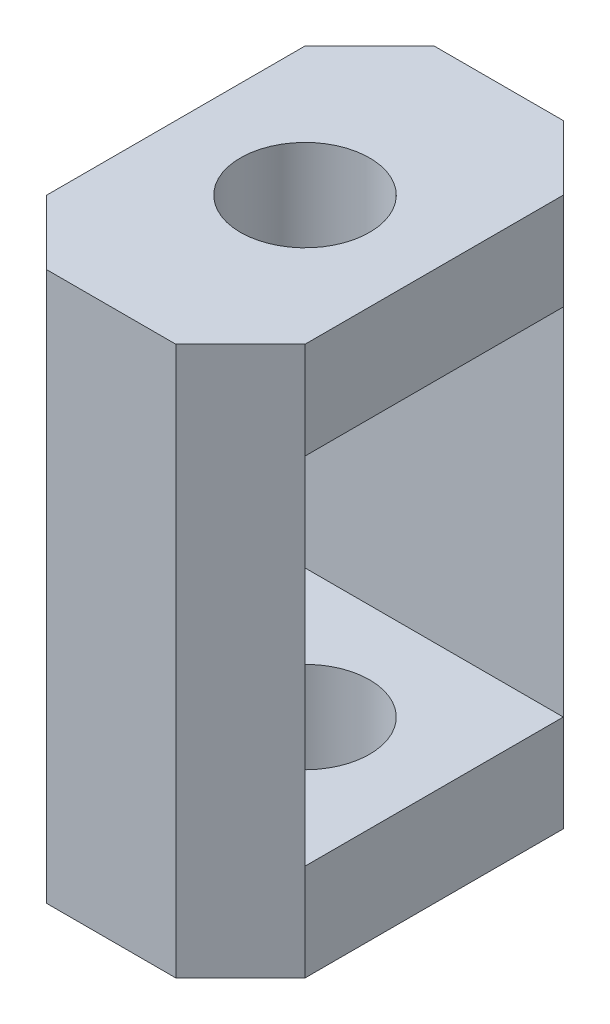
ISO-10303-21;
HEADER;
FILE_DESCRIPTION(('STEP AP214'),'2;1');
FILE_NAME('part.step','',(''),(''),'','','');
FILE_SCHEMA(('AUTOMOTIVE_DESIGN { 1 0 10303 214 1 1 1 1 }'));
ENDSEC;
DATA;
#1=APPLICATION_CONTEXT('core data for automotive mechanical design processes');
#2=APPLICATION_PROTOCOL_DEFINITION('international standard','automotive_design',2000,#1);
#3=PRODUCT_CONTEXT('',#1,'mechanical');
#4=PRODUCT('Part','Part','',(#3));
#5=PRODUCT_RELATED_PRODUCT_CATEGORY('part','',(#4));
#6=PRODUCT_DEFINITION_FORMATION('','',#4);
#7=PRODUCT_DEFINITION_CONTEXT('part definition',#1,'design');
#8=PRODUCT_DEFINITION('design','',#6,#7);
#9=PRODUCT_DEFINITION_SHAPE('','',#8);
#10=(LENGTH_UNIT() NAMED_UNIT(*) SI_UNIT(.MILLI.,.METRE.));
#11=(NAMED_UNIT(*) PLANE_ANGLE_UNIT() SI_UNIT($,.RADIAN.));
#12=(NAMED_UNIT(*) SI_UNIT($,.STERADIAN.) SOLID_ANGLE_UNIT());
#13=UNCERTAINTY_MEASURE_WITH_UNIT(LENGTH_MEASURE(1.E-05),#10,'distance_accuracy_value','');
#14=(GEOMETRIC_REPRESENTATION_CONTEXT(3) GLOBAL_UNCERTAINTY_ASSIGNED_CONTEXT((#13)) GLOBAL_UNIT_ASSIGNED_CONTEXT((#10,
#11,#12)) REPRESENTATION_CONTEXT('',''));
#15=CARTESIAN_POINT('',(0.,0.,0.));
#16=DIRECTION('',(0.,0.,1.));
#17=DIRECTION('',(1.,0.,0.));
#18=AXIS2_PLACEMENT_3D('',#15,#16,#17);
#19=CARTESIAN_POINT('',(4.,17.,6.));
#20=DIRECTION('',(-1.,0.,0.));
#21=DIRECTION('',(0.,0.,1.));
#22=AXIS2_PLACEMENT_3D('',#19,#20,#21);
#23=PLANE('',#22);
#24=DIRECTION('',(0.,0.,-1.));
#25=VECTOR('',#24,1.);
#26=CARTESIAN_POINT('',(4.,0.,6.));
#27=LINE('',#26,#25);
#28=CARTESIAN_POINT('',(4.,0.,4.));
#29=VERTEX_POINT('',#28);
#30=CARTESIAN_POINT('',(4.,0.,-3.99999999999999));
#31=VERTEX_POINT('',#30);
#32=EDGE_CURVE('E192',#29,#31,#27,.T.);
#33=ORIENTED_EDGE('',*,*,#32,.T.);
#34=DIRECTION('',(0.,1.,0.));
#35=VECTOR('',#34,1.);
#36=CARTESIAN_POINT('',(4.,17.,-3.99999999999999));
#37=LINE('',#36,#35);
#38=CARTESIAN_POINT('',(4.,3.,-4.));
#39=VERTEX_POINT('',#38);
#40=EDGE_CURVE('E11',#31,#39,#37,.T.);
#41=ORIENTED_EDGE('',*,*,#40,.T.);
#42=DIRECTION('',(0.,0.,-1.));
#43=VECTOR('',#42,1.);
#44=CARTESIAN_POINT('',(4.,3.,4.));
#45=LINE('',#44,#43);
#46=CARTESIAN_POINT('',(4.,3.,4.));
#47=VERTEX_POINT('',#46);
#48=EDGE_CURVE('E144',#47,#39,#45,.T.);
#49=ORIENTED_EDGE('',*,*,#48,.F.);
#50=DIRECTION('',(0.,-1.,0.));
#51=VECTOR('',#50,1.);
#52=CARTESIAN_POINT('',(4.,17.,4.));
#53=LINE('',#52,#51);
#54=EDGE_CURVE('E140',#47,#29,#53,.T.);
#55=ORIENTED_EDGE('',*,*,#54,.T.);
#56=EDGE_LOOP('',(#33,#41,#49,#55));
#57=FACE_BOUND('',#56,.T.);
#58=ADVANCED_FACE('F43',(#57),#23,.F.);
#59=CARTESIAN_POINT('',(-4.,17.,6.));
#60=DIRECTION('',(1.,0.,0.));
#61=DIRECTION('',(0.,0.,-1.));
#62=AXIS2_PLACEMENT_3D('',#59,#60,#61);
#63=PLANE('',#62);
#64=DIRECTION('',(0.,0.,1.));
#65=VECTOR('',#64,1.);
#66=CARTESIAN_POINT('',(-4.,0.,6.));
#67=LINE('',#66,#65);
#68=CARTESIAN_POINT('',(-4.,0.,-4.));
#69=VERTEX_POINT('',#68);
#70=CARTESIAN_POINT('',(-4.,0.,3.99999999999999));
#71=VERTEX_POINT('',#70);
#72=EDGE_CURVE('E207',#69,#71,#67,.T.);
#73=ORIENTED_EDGE('',*,*,#72,.T.);
#74=DIRECTION('',(0.,1.,0.));
#75=VECTOR('',#74,1.);
#76=CARTESIAN_POINT('',(-4.,17.,3.99999999999999));
#77=LINE('',#76,#75);
#78=CARTESIAN_POINT('',(-4.,3.,4.));
#79=VERTEX_POINT('',#78);
#80=EDGE_CURVE('E244',#71,#79,#77,.T.);
#81=ORIENTED_EDGE('',*,*,#80,.T.);
#82=DIRECTION('',(0.,0.,-1.));
#83=VECTOR('',#82,1.);
#84=CARTESIAN_POINT('',(-4.,3.,6.));
#85=LINE('',#84,#83);
#86=CARTESIAN_POINT('',(-4.,3.,-4.));
#87=VERTEX_POINT('',#86);
#88=EDGE_CURVE('E183',#79,#87,#85,.T.);
#89=ORIENTED_EDGE('',*,*,#88,.T.);
#90=DIRECTION('',(0.,-1.,0.));
#91=VECTOR('',#90,1.);
#92=CARTESIAN_POINT('',(-4.,17.,-4.));
#93=LINE('',#92,#91);
#94=EDGE_CURVE('E233',#87,#69,#93,.T.);
#95=ORIENTED_EDGE('',*,*,#94,.T.);
#96=EDGE_LOOP('',(#73,#81,#89,#95));
#97=FACE_BOUND('',#96,.T.);
#98=ADVANCED_FACE('F299',(#97),#63,.F.);
#99=CARTESIAN_POINT('',(0.,17.,0.));
#100=DIRECTION('',(0.,-1.,0.));
#101=DIRECTION('',(0.,0.,-1.));
#102=AXIS2_PLACEMENT_3D('',#99,#100,#101);
#103=CYLINDRICAL_SURFACE('',#102,2.);
#104=CARTESIAN_POINT('',(0.,3.,0.));
#105=DIRECTION('',(0.,-1.,0.));
#106=DIRECTION('',(0.,0.,-1.));
#107=AXIS2_PLACEMENT_3D('',#104,#105,#106);
#108=CIRCLE('',#107,2.);
#109=CARTESIAN_POINT('',(0.,3.,-2.));
#110=VERTEX_POINT('',#109);
#111=EDGE_CURVE('E184',#110,#110,#108,.T.);
#112=ORIENTED_EDGE('',*,*,#111,.F.);
#113=EDGE_LOOP('',(#112));
#114=FACE_BOUND('',#113,.T.);
#115=CARTESIAN_POINT('',(0.,0.,0.));
#116=DIRECTION('',(0.,1.,0.));
#117=DIRECTION('',(0.,0.,1.));
#118=AXIS2_PLACEMENT_3D('',#115,#116,#117);
#119=CIRCLE('',#118,2.);
#120=CARTESIAN_POINT('',(0.,0.,2.));
#121=VERTEX_POINT('',#120);
#122=EDGE_CURVE('E190',#121,#121,#119,.T.);
#123=ORIENTED_EDGE('',*,*,#122,.F.);
#124=EDGE_LOOP('',(#123));
#125=FACE_BOUND('',#124,.T.);
#126=ADVANCED_FACE('F300',(#114,#125),#103,.F.);
#127=CARTESIAN_POINT('',(0.,17.,0.));
#128=DIRECTION('',(0.,-1.,0.));
#129=DIRECTION('',(0.,0.,-1.));
#130=AXIS2_PLACEMENT_3D('',#127,#128,#129);
#131=PLANE('',#130);
#132=DIRECTION('',(0.,0.,1.));
#133=VECTOR('',#132,1.);
#134=CARTESIAN_POINT('',(-4.,17.,6.));
#135=LINE('',#134,#133);
#136=CARTESIAN_POINT('',(-4.,17.,-4.));
#137=VERTEX_POINT('',#136);
#138=CARTESIAN_POINT('',(-4.,17.,3.99999999999999));
#139=VERTEX_POINT('',#138);
#140=EDGE_CURVE('E200',#137,#139,#135,.T.);
#141=ORIENTED_EDGE('',*,*,#140,.T.);
#142=DIRECTION('',(-0.707106781186547,0.,-0.707106781186548));
#143=VECTOR('',#142,1.);
#144=CARTESIAN_POINT('',(-2.,17.,6.));
#145=LINE('',#144,#143);
#146=CARTESIAN_POINT('',(-2.,17.,6.));
#147=VERTEX_POINT('',#146);
#148=EDGE_CURVE('E249',#139,#147,#145,.F.);
#149=ORIENTED_EDGE('',*,*,#148,.T.);
#150=DIRECTION('',(1.,0.,0.));
#151=VECTOR('',#150,1.);
#152=CARTESIAN_POINT('',(-4.,17.,6.));
#153=LINE('',#152,#151);
#154=CARTESIAN_POINT('',(2.,17.,6.));
#155=VERTEX_POINT('',#154);
#156=EDGE_CURVE('E205',#147,#155,#153,.T.);
#157=ORIENTED_EDGE('',*,*,#156,.T.);
#158=DIRECTION('',(-0.707106781186548,0.,0.707106781186547));
#159=VECTOR('',#158,1.);
#160=CARTESIAN_POINT('',(4.,17.,4.));
#161=LINE('',#160,#159);
#162=CARTESIAN_POINT('',(4.,17.,4.));
#163=VERTEX_POINT('',#162);
#164=EDGE_CURVE('E245',#155,#163,#161,.F.);
#165=ORIENTED_EDGE('',*,*,#164,.T.);
#166=DIRECTION('',(0.,0.,-1.));
#167=VECTOR('',#166,1.);
#168=CARTESIAN_POINT('',(4.,17.,6.));
#169=LINE('',#168,#167);
#170=CARTESIAN_POINT('',(4.,17.,-3.99999999999999));
#171=VERTEX_POINT('',#170);
#172=EDGE_CURVE('E152',#163,#171,#169,.T.);
#173=ORIENTED_EDGE('',*,*,#172,.T.);
#174=DIRECTION('',(0.707106781186547,0.,0.707106781186548));
#175=VECTOR('',#174,1.);
#176=CARTESIAN_POINT('',(2.,17.,-6.));
#177=LINE('',#176,#175);
#178=CARTESIAN_POINT('',(2.,17.,-6.));
#179=VERTEX_POINT('',#178);
#180=EDGE_CURVE('E66',#171,#179,#177,.F.);
#181=ORIENTED_EDGE('',*,*,#180,.T.);
#182=DIRECTION('',(-1.,0.,0.));
#183=VECTOR('',#182,1.);
#184=CARTESIAN_POINT('',(-4.,17.,-6.));
#185=LINE('',#184,#183);
#186=CARTESIAN_POINT('',(-2.,17.,-6.));
#187=VERTEX_POINT('',#186);
#188=EDGE_CURVE('E198',#179,#187,#185,.T.);
#189=ORIENTED_EDGE('',*,*,#188,.T.);
#190=DIRECTION('',(0.707106781186548,0.,-0.707106781186547));
#191=VECTOR('',#190,1.);
#192=CARTESIAN_POINT('',(-4.,17.,-4.));
#193=LINE('',#192,#191);
#194=EDGE_CURVE('E246',#187,#137,#193,.F.);
#195=ORIENTED_EDGE('',*,*,#194,.T.);
#196=EDGE_LOOP('',(#141,#149,#157,#165,#173,#181,#189,#195));
#197=FACE_BOUND('',#196,.T.);
#198=CARTESIAN_POINT('',(0.,17.,0.));
#199=DIRECTION('',(0.,1.,0.));
#200=DIRECTION('',(0.,0.,1.));
#201=AXIS2_PLACEMENT_3D('',#198,#199,#200);
#202=CIRCLE('',#201,2.);
#203=CARTESIAN_POINT('',(0.,17.,2.));
#204=VERTEX_POINT('',#203);
#205=EDGE_CURVE('E188',#204,#204,#202,.T.);
#206=ORIENTED_EDGE('',*,*,#205,.F.);
#207=EDGE_LOOP('',(#206));
#208=FACE_BOUND('',#207,.T.);
#209=ADVANCED_FACE('F258',(#197,#208),#131,.F.);
#210=CARTESIAN_POINT('',(0.,0.,0.));
#211=DIRECTION('',(0.,-1.,0.));
#212=DIRECTION('',(0.,0.,-1.));
#213=AXIS2_PLACEMENT_3D('',#210,#211,#212);
#214=PLANE('',#213);
#215=DIRECTION('',(1.,0.,0.));
#216=VECTOR('',#215,1.);
#217=CARTESIAN_POINT('',(-4.,0.,6.));
#218=LINE('',#217,#216);
#219=CARTESIAN_POINT('',(-2.,0.,6.));
#220=VERTEX_POINT('',#219);
#221=CARTESIAN_POINT('',(2.,0.,6.));
#222=VERTEX_POINT('',#221);
#223=EDGE_CURVE('E197',#220,#222,#218,.T.);
#224=ORIENTED_EDGE('',*,*,#223,.F.);
#225=DIRECTION('',(0.707106781186547,0.,0.707106781186548));
#226=VECTOR('',#225,1.);
#227=CARTESIAN_POINT('',(-4.,0.,3.99999999999999));
#228=LINE('',#227,#226);
#229=EDGE_CURVE('E232',#220,#71,#228,.F.);
#230=ORIENTED_EDGE('',*,*,#229,.T.);
#231=ORIENTED_EDGE('',*,*,#72,.F.);
#232=DIRECTION('',(-0.707106781186548,0.,0.707106781186547));
#233=VECTOR('',#232,1.);
#234=CARTESIAN_POINT('',(-4.,0.,-4.));
#235=LINE('',#234,#233);
#236=CARTESIAN_POINT('',(-2.,0.,-6.));
#237=VERTEX_POINT('',#236);
#238=EDGE_CURVE('E227',#69,#237,#235,.F.);
#239=ORIENTED_EDGE('',*,*,#238,.T.);
#240=DIRECTION('',(-1.,0.,0.));
#241=VECTOR('',#240,1.);
#242=CARTESIAN_POINT('',(-4.,0.,-6.));
#243=LINE('',#242,#241);
#244=CARTESIAN_POINT('',(2.,0.,-6.));
#245=VERTEX_POINT('',#244);
#246=EDGE_CURVE('E210',#245,#237,#243,.T.);
#247=ORIENTED_EDGE('',*,*,#246,.F.);
#248=DIRECTION('',(-0.707106781186547,0.,-0.707106781186548));
#249=VECTOR('',#248,1.);
#250=CARTESIAN_POINT('',(4.,0.,-3.99999999999999));
#251=LINE('',#250,#249);
#252=EDGE_CURVE('E230',#245,#31,#251,.F.);
#253=ORIENTED_EDGE('',*,*,#252,.T.);
#254=ORIENTED_EDGE('',*,*,#32,.F.);
#255=DIRECTION('',(0.707106781186548,0.,-0.707106781186547));
#256=VECTOR('',#255,1.);
#257=CARTESIAN_POINT('',(4.,0.,4.));
#258=LINE('',#257,#256);
#259=EDGE_CURVE('E229',#29,#222,#258,.F.);
#260=ORIENTED_EDGE('',*,*,#259,.T.);
#261=EDGE_LOOP('',(#224,#230,#231,#239,#247,#253,#254,#260));
#262=FACE_BOUND('',#261,.T.);
#263=ORIENTED_EDGE('',*,*,#122,.T.);
#264=EDGE_LOOP('',(#263));
#265=FACE_BOUND('',#264,.T.);
#266=ADVANCED_FACE('F264',(#262,#265),#214,.T.);
#267=DIRECTION('',(0.,0.,1.));
#268=VECTOR('',#267,1.);
#269=CARTESIAN_POINT('',(4.,14.,4.));
#270=LINE('',#269,#268);
#271=CARTESIAN_POINT('',(4.,14.,-4.));
#272=VERTEX_POINT('',#271);
#273=CARTESIAN_POINT('',(4.,14.,4.));
#274=VERTEX_POINT('',#273);
#275=EDGE_CURVE('E148',#272,#274,#270,.T.);
#276=ORIENTED_EDGE('',*,*,#275,.F.);
#277=DIRECTION('',(0.,1.,0.));
#278=VECTOR('',#277,1.);
#279=CARTESIAN_POINT('',(4.,17.,-3.99999999999999));
#280=LINE('',#279,#278);
#281=EDGE_CURVE('E55',#272,#171,#280,.T.);
#282=ORIENTED_EDGE('',*,*,#281,.T.);
#283=ORIENTED_EDGE('',*,*,#172,.F.);
#284=DIRECTION('',(0.,-1.,0.));
#285=VECTOR('',#284,1.);
#286=CARTESIAN_POINT('',(4.,17.,4.));
#287=LINE('',#286,#285);
#288=EDGE_CURVE('E139',#163,#274,#287,.T.);
#289=ORIENTED_EDGE('',*,*,#288,.T.);
#290=EDGE_LOOP('',(#276,#282,#283,#289));
#291=FACE_BOUND('',#290,.T.);
#292=ADVANCED_FACE('F151',(#291),#23,.F.);
#293=CARTESIAN_POINT('',(-4.,17.,-6.));
#294=DIRECTION('',(0.,0.,1.));
#295=DIRECTION('',(1.,0.,0.));
#296=AXIS2_PLACEMENT_3D('',#293,#294,#295);
#297=PLANE('',#296);
#298=ORIENTED_EDGE('',*,*,#246,.T.);
#299=DIRECTION('',(0.,1.,0.));
#300=VECTOR('',#299,1.);
#301=CARTESIAN_POINT('',(-2.,17.,-6.));
#302=LINE('',#301,#300);
#303=EDGE_CURVE('E56',#237,#187,#302,.T.);
#304=ORIENTED_EDGE('',*,*,#303,.T.);
#305=ORIENTED_EDGE('',*,*,#188,.F.);
#306=DIRECTION('',(0.,-1.,0.));
#307=VECTOR('',#306,1.);
#308=CARTESIAN_POINT('',(2.,17.,-6.));
#309=LINE('',#308,#307);
#310=EDGE_CURVE('E250',#179,#245,#309,.T.);
#311=ORIENTED_EDGE('',*,*,#310,.T.);
#312=EDGE_LOOP('',(#298,#304,#305,#311));
#313=FACE_BOUND('',#312,.T.);
#314=ADVANCED_FACE('F265',(#313),#297,.F.);
#315=DIRECTION('',(0.,0.,1.));
#316=VECTOR('',#315,1.);
#317=CARTESIAN_POINT('',(-4.,14.,6.));
#318=LINE('',#317,#316);
#319=CARTESIAN_POINT('',(-4.,14.,-4.));
#320=VERTEX_POINT('',#319);
#321=CARTESIAN_POINT('',(-4.,14.,4.));
#322=VERTEX_POINT('',#321);
#323=EDGE_CURVE('E185',#320,#322,#318,.T.);
#324=ORIENTED_EDGE('',*,*,#323,.T.);
#325=DIRECTION('',(0.,1.,0.));
#326=VECTOR('',#325,1.);
#327=CARTESIAN_POINT('',(-4.,17.,3.99999999999999));
#328=LINE('',#327,#326);
#329=EDGE_CURVE('E239',#322,#139,#328,.T.);
#330=ORIENTED_EDGE('',*,*,#329,.T.);
#331=ORIENTED_EDGE('',*,*,#140,.F.);
#332=DIRECTION('',(0.,-1.,0.));
#333=VECTOR('',#332,1.);
#334=CARTESIAN_POINT('',(-4.,17.,-4.));
#335=LINE('',#334,#333);
#336=EDGE_CURVE('E237',#137,#320,#335,.T.);
#337=ORIENTED_EDGE('',*,*,#336,.T.);
#338=EDGE_LOOP('',(#324,#330,#331,#337));
#339=FACE_BOUND('',#338,.T.);
#340=ADVANCED_FACE('F279',(#339),#63,.F.);
#341=CARTESIAN_POINT('',(-4.,17.,6.));
#342=DIRECTION('',(0.,0.,-1.));
#343=DIRECTION('',(-1.,0.,0.));
#344=AXIS2_PLACEMENT_3D('',#341,#342,#343);
#345=PLANE('',#344);
#346=ORIENTED_EDGE('',*,*,#156,.F.);
#347=DIRECTION('',(0.,-1.,0.));
#348=VECTOR('',#347,1.);
#349=CARTESIAN_POINT('',(-2.,17.,6.));
#350=LINE('',#349,#348);
#351=EDGE_CURVE('E224',#147,#220,#350,.T.);
#352=ORIENTED_EDGE('',*,*,#351,.T.);
#353=ORIENTED_EDGE('',*,*,#223,.T.);
#354=DIRECTION('',(0.,1.,0.));
#355=VECTOR('',#354,1.);
#356=CARTESIAN_POINT('',(2.,17.,6.));
#357=LINE('',#356,#355);
#358=EDGE_CURVE('E222',#222,#155,#357,.T.);
#359=ORIENTED_EDGE('',*,*,#358,.T.);
#360=EDGE_LOOP('',(#346,#352,#353,#359));
#361=FACE_BOUND('',#360,.T.);
#362=ADVANCED_FACE('F286',(#361),#345,.F.);
#363=CARTESIAN_POINT('',(0.,14.,0.));
#364=DIRECTION('',(0.,1.,0.));
#365=DIRECTION('',(0.,0.,1.));
#366=AXIS2_PLACEMENT_3D('',#363,#364,#365);
#367=CIRCLE('',#366,2.);
#368=CARTESIAN_POINT('',(0.,14.,2.));
#369=VERTEX_POINT('',#368);
#370=EDGE_CURVE('E178',#369,#369,#367,.T.);
#371=ORIENTED_EDGE('',*,*,#370,.F.);
#372=EDGE_LOOP('',(#371));
#373=FACE_BOUND('',#372,.T.);
#374=ORIENTED_EDGE('',*,*,#205,.T.);
#375=EDGE_LOOP('',(#374));
#376=FACE_BOUND('',#375,.T.);
#377=ADVANCED_FACE('F307',(#373,#376),#103,.F.);
#378=CARTESIAN_POINT('',(-13.,3.,-4.));
#379=DIRECTION('',(0.,0.,-1.));
#380=DIRECTION('',(-1.,0.,0.));
#381=AXIS2_PLACEMENT_3D('',#378,#379,#380);
#382=PLANE('',#381);
#383=DIRECTION('',(1.,0.,0.));
#384=VECTOR('',#383,1.);
#385=CARTESIAN_POINT('',(-13.,3.,-4.));
#386=LINE('',#385,#384);
#387=EDGE_CURVE('E176',#87,#39,#386,.T.);
#388=ORIENTED_EDGE('',*,*,#387,.T.);
#389=DIRECTION('',(0.,1.,0.));
#390=VECTOR('',#389,1.);
#391=CARTESIAN_POINT('',(4.,3.,-4.));
#392=LINE('',#391,#390);
#393=EDGE_CURVE('E168',#39,#272,#392,.T.);
#394=ORIENTED_EDGE('',*,*,#393,.T.);
#395=DIRECTION('',(1.,0.,0.));
#396=VECTOR('',#395,1.);
#397=CARTESIAN_POINT('',(-13.,14.,-4.));
#398=LINE('',#397,#396);
#399=EDGE_CURVE('E164',#320,#272,#398,.T.);
#400=ORIENTED_EDGE('',*,*,#399,.F.);
#401=DIRECTION('',(0.,1.,0.));
#402=VECTOR('',#401,1.);
#403=CARTESIAN_POINT('',(-4.,17.,-4.));
#404=LINE('',#403,#402);
#405=EDGE_CURVE('E218',#87,#320,#404,.T.);
#406=ORIENTED_EDGE('',*,*,#405,.F.);
#407=EDGE_LOOP('',(#388,#394,#400,#406));
#408=FACE_BOUND('',#407,.T.);
#409=ADVANCED_FACE('F290',(#408),#382,.F.);
#410=CARTESIAN_POINT('',(-13.,3.,4.));
#411=DIRECTION('',(0.,0.,1.));
#412=DIRECTION('',(1.,0.,0.));
#413=AXIS2_PLACEMENT_3D('',#410,#411,#412);
#414=PLANE('',#413);
#415=DIRECTION('',(1.,0.,0.));
#416=VECTOR('',#415,1.);
#417=CARTESIAN_POINT('',(-13.,14.,4.));
#418=LINE('',#417,#416);
#419=EDGE_CURVE('E160',#322,#274,#418,.T.);
#420=ORIENTED_EDGE('',*,*,#419,.T.);
#421=DIRECTION('',(0.,-1.,0.));
#422=VECTOR('',#421,1.);
#423=CARTESIAN_POINT('',(4.,3.,4.));
#424=LINE('',#423,#422);
#425=EDGE_CURVE('E132',#274,#47,#424,.T.);
#426=ORIENTED_EDGE('',*,*,#425,.T.);
#427=DIRECTION('',(1.,0.,0.));
#428=VECTOR('',#427,1.);
#429=CARTESIAN_POINT('',(-13.,3.,4.));
#430=LINE('',#429,#428);
#431=EDGE_CURVE('E163',#79,#47,#430,.T.);
#432=ORIENTED_EDGE('',*,*,#431,.F.);
#433=DIRECTION('',(0.,-1.,0.));
#434=VECTOR('',#433,1.);
#435=CARTESIAN_POINT('',(-4.,17.,4.));
#436=LINE('',#435,#434);
#437=EDGE_CURVE('E159',#322,#79,#436,.T.);
#438=ORIENTED_EDGE('',*,*,#437,.F.);
#439=EDGE_LOOP('',(#420,#426,#432,#438));
#440=FACE_BOUND('',#439,.T.);
#441=ADVANCED_FACE('F158',(#440),#414,.F.);
#442=CARTESIAN_POINT('',(-13.,3.,4.));
#443=DIRECTION('',(0.,-1.,0.));
#444=DIRECTION('',(0.,0.,-1.));
#445=AXIS2_PLACEMENT_3D('',#442,#443,#444);
#446=PLANE('',#445);
#447=ORIENTED_EDGE('',*,*,#111,.T.);
#448=EDGE_LOOP('',(#447));
#449=FACE_BOUND('',#448,.T.);
#450=ORIENTED_EDGE('',*,*,#431,.T.);
#451=ORIENTED_EDGE('',*,*,#48,.T.);
#452=ORIENTED_EDGE('',*,*,#387,.F.);
#453=ORIENTED_EDGE('',*,*,#88,.F.);
#454=EDGE_LOOP('',(#450,#451,#452,#453));
#455=FACE_BOUND('',#454,.T.);
#456=ADVANCED_FACE('F294',(#449,#455),#446,.F.);
#457=CARTESIAN_POINT('',(-13.,14.,4.));
#458=DIRECTION('',(0.,1.,0.));
#459=DIRECTION('',(0.,0.,1.));
#460=AXIS2_PLACEMENT_3D('',#457,#458,#459);
#461=PLANE('',#460);
#462=ORIENTED_EDGE('',*,*,#370,.T.);
#463=EDGE_LOOP('',(#462));
#464=FACE_BOUND('',#463,.T.);
#465=ORIENTED_EDGE('',*,*,#399,.T.);
#466=ORIENTED_EDGE('',*,*,#275,.T.);
#467=ORIENTED_EDGE('',*,*,#419,.F.);
#468=ORIENTED_EDGE('',*,*,#323,.F.);
#469=EDGE_LOOP('',(#465,#466,#467,#468));
#470=FACE_BOUND('',#469,.T.);
#471=ADVANCED_FACE('F169',(#464,#470),#461,.F.);
#472=CARTESIAN_POINT('',(-2.,17.,6.));
#473=DIRECTION('',(0.707106781186548,0.,-0.707106781186547));
#474=DIRECTION('',(0.,-1.,0.));
#475=AXIS2_PLACEMENT_3D('',#472,#473,#474);
#476=PLANE('',#475);
#477=ORIENTED_EDGE('',*,*,#437,.T.);
#478=ORIENTED_EDGE('',*,*,#80,.F.);
#479=ORIENTED_EDGE('',*,*,#229,.F.);
#480=ORIENTED_EDGE('',*,*,#351,.F.);
#481=ORIENTED_EDGE('',*,*,#148,.F.);
#482=ORIENTED_EDGE('',*,*,#329,.F.);
#483=EDGE_LOOP('',(#477,#478,#479,#480,#481,#482));
#484=FACE_BOUND('',#483,.T.);
#485=ADVANCED_FACE('F284',(#484),#476,.F.);
#486=CARTESIAN_POINT('',(-4.,17.,-4.));
#487=DIRECTION('',(0.707106781186547,0.,0.707106781186548));
#488=DIRECTION('',(0.,-1.,0.));
#489=AXIS2_PLACEMENT_3D('',#486,#487,#488);
#490=PLANE('',#489);
#491=ORIENTED_EDGE('',*,*,#194,.F.);
#492=ORIENTED_EDGE('',*,*,#303,.F.);
#493=ORIENTED_EDGE('',*,*,#238,.F.);
#494=ORIENTED_EDGE('',*,*,#94,.F.);
#495=ORIENTED_EDGE('',*,*,#405,.T.);
#496=ORIENTED_EDGE('',*,*,#336,.F.);
#497=EDGE_LOOP('',(#491,#492,#493,#494,#495,#496));
#498=FACE_BOUND('',#497,.T.);
#499=ADVANCED_FACE('F272',(#498),#490,.F.);
#500=CARTESIAN_POINT('',(2.,17.,-6.));
#501=DIRECTION('',(-0.707106781186548,0.,0.707106781186547));
#502=DIRECTION('',(0.,-1.,0.));
#503=AXIS2_PLACEMENT_3D('',#500,#501,#502);
#504=PLANE('',#503);
#505=ORIENTED_EDGE('',*,*,#393,.F.);
#506=ORIENTED_EDGE('',*,*,#40,.F.);
#507=ORIENTED_EDGE('',*,*,#252,.F.);
#508=ORIENTED_EDGE('',*,*,#310,.F.);
#509=ORIENTED_EDGE('',*,*,#180,.F.);
#510=ORIENTED_EDGE('',*,*,#281,.F.);
#511=EDGE_LOOP('',(#505,#506,#507,#508,#509,#510));
#512=FACE_BOUND('',#511,.T.);
#513=ADVANCED_FACE('F259',(#512),#504,.F.);
#514=CARTESIAN_POINT('',(4.,17.,4.));
#515=DIRECTION('',(-0.707106781186547,0.,-0.707106781186548));
#516=DIRECTION('',(0.,-1.,0.));
#517=AXIS2_PLACEMENT_3D('',#514,#515,#516);
#518=PLANE('',#517);
#519=ORIENTED_EDGE('',*,*,#164,.F.);
#520=ORIENTED_EDGE('',*,*,#358,.F.);
#521=ORIENTED_EDGE('',*,*,#259,.F.);
#522=ORIENTED_EDGE('',*,*,#54,.F.);
#523=ORIENTED_EDGE('',*,*,#425,.F.);
#524=ORIENTED_EDGE('',*,*,#288,.F.);
#525=EDGE_LOOP('',(#519,#520,#521,#522,#523,#524));
#526=FACE_BOUND('',#525,.T.);
#527=ADVANCED_FACE('F46',(#526),#518,.F.);
#528=CLOSED_SHELL('',(#58,#98,#126,#209,#266,#292,#314,#340,#362,#377,#409,#441,#456,#471,#485,
#499,#513,#527));
#529=MANIFOLD_SOLID_BREP('B2',#528);
#530=ADVANCED_BREP_SHAPE_REPRESENTATION('',(#18,#529),#14);
#531=SHAPE_DEFINITION_REPRESENTATION(#9,#530);
ENDSEC;
END-ISO-10303-21;
